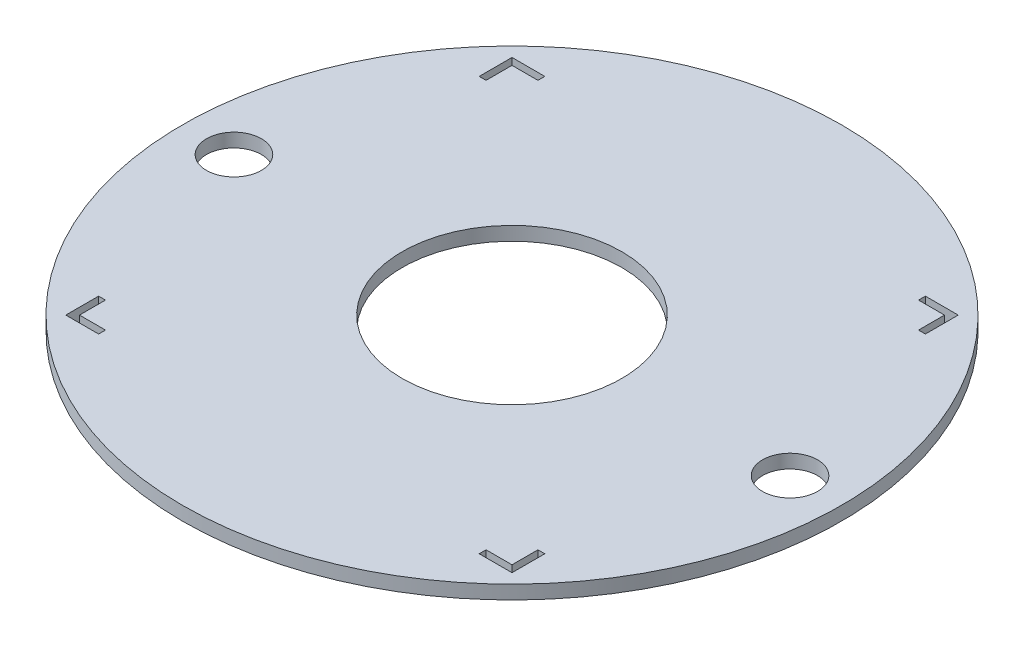
ISO-10303-21;
HEADER;
FILE_DESCRIPTION(('STEP AP214'),'2;1');
FILE_NAME('part.step','',(''),(''),'','','');
FILE_SCHEMA(('AUTOMOTIVE_DESIGN { 1 0 10303 214 1 1 1 1 }'));
ENDSEC;
DATA;
#1=APPLICATION_CONTEXT('core data for automotive mechanical design processes');
#2=APPLICATION_PROTOCOL_DEFINITION('international standard','automotive_design',2000,#1);
#3=PRODUCT_CONTEXT('',#1,'mechanical');
#4=PRODUCT('Part','Part','',(#3));
#5=PRODUCT_RELATED_PRODUCT_CATEGORY('part','',(#4));
#6=PRODUCT_DEFINITION_FORMATION('','',#4);
#7=PRODUCT_DEFINITION_CONTEXT('part definition',#1,'design');
#8=PRODUCT_DEFINITION('design','',#6,#7);
#9=PRODUCT_DEFINITION_SHAPE('','',#8);
#10=(LENGTH_UNIT() NAMED_UNIT(*) SI_UNIT(.MILLI.,.METRE.));
#11=(NAMED_UNIT(*) PLANE_ANGLE_UNIT() SI_UNIT($,.RADIAN.));
#12=(NAMED_UNIT(*) SI_UNIT($,.STERADIAN.) SOLID_ANGLE_UNIT());
#13=UNCERTAINTY_MEASURE_WITH_UNIT(LENGTH_MEASURE(1.E-05),#10,'distance_accuracy_value','');
#14=(GEOMETRIC_REPRESENTATION_CONTEXT(3) GLOBAL_UNCERTAINTY_ASSIGNED_CONTEXT((#13)) GLOBAL_UNIT_ASSIGNED_CONTEXT((#10,
#11,#12)) REPRESENTATION_CONTEXT('',''));
#15=CARTESIAN_POINT('',(0.,0.,0.));
#16=DIRECTION('',(0.,0.,1.));
#17=DIRECTION('',(1.,0.,0.));
#18=AXIS2_PLACEMENT_3D('',#15,#16,#17);
#19=CARTESIAN_POINT('',(0.,3.175,0.));
#20=DIRECTION('',(0.,1.,0.));
#21=DIRECTION('',(0.,0.,1.));
#22=AXIS2_PLACEMENT_3D('',#19,#20,#21);
#23=PLANE('',#22);
#24=CARTESIAN_POINT('',(64.2875,3.175,0.));
#25=DIRECTION('',(0.,1.,0.));
#26=DIRECTION('',(0.,0.,1.));
#27=AXIS2_PLACEMENT_3D('',#24,#25,#26);
#28=CIRCLE('',#27,6.35);
#29=CARTESIAN_POINT('',(64.2875,3.175,6.35));
#30=VERTEX_POINT('',#29);
#31=EDGE_CURVE('E395',#30,#30,#28,.T.);
#32=ORIENTED_EDGE('',*,*,#31,.F.);
#33=EDGE_LOOP('',(#32));
#34=FACE_BOUND('',#33,.T.);
#35=CARTESIAN_POINT('',(-64.2875,3.175,0.));
#36=DIRECTION('',(0.,1.,0.));
#37=DIRECTION('',(0.,0.,1.));
#38=AXIS2_PLACEMENT_3D('',#35,#36,#37);
#39=CIRCLE('',#38,6.35);
#40=CARTESIAN_POINT('',(-64.2875,3.175,6.35));
#41=VERTEX_POINT('',#40);
#42=EDGE_CURVE('E386',#41,#41,#39,.T.);
#43=ORIENTED_EDGE('',*,*,#42,.F.);
#44=EDGE_LOOP('',(#43));
#45=FACE_BOUND('',#44,.T.);
#46=CARTESIAN_POINT('',(0.,3.175,0.));
#47=DIRECTION('',(0.,1.,0.));
#48=DIRECTION('',(0.,0.,1.));
#49=AXIS2_PLACEMENT_3D('',#46,#47,#48);
#50=CIRCLE('',#49,25.4);
#51=CARTESIAN_POINT('',(0.,3.175,25.4));
#52=VERTEX_POINT('',#51);
#53=EDGE_CURVE('E385',#52,#52,#50,.T.);
#54=ORIENTED_EDGE('',*,*,#53,.F.);
#55=EDGE_LOOP('',(#54));
#56=FACE_BOUND('',#55,.T.);
#57=CARTESIAN_POINT('',(0.,3.175,0.));
#58=DIRECTION('',(0.,1.,0.));
#59=DIRECTION('',(0.,0.,1.));
#60=AXIS2_PLACEMENT_3D('',#57,#58,#59);
#61=CIRCLE('',#60,76.2);
#62=CARTESIAN_POINT('',(0.,3.175,76.2));
#63=VERTEX_POINT('',#62);
#64=EDGE_CURVE('E11',#63,#63,#61,.T.);
#65=ORIENTED_EDGE('',*,*,#64,.T.);
#66=EDGE_LOOP('',(#65));
#67=FACE_BOUND('',#66,.T.);
#68=DIRECTION('',(1.,0.,0.));
#69=VECTOR('',#68,1.);
#70=CARTESIAN_POINT('',(51.5875,3.175,-44.0000000000001));
#71=LINE('',#70,#69);
#72=CARTESIAN_POINT('',(50.,3.175,-44.));
#73=VERTEX_POINT('',#72);
#74=CARTESIAN_POINT('',(51.5875,3.175,-44.0000000000001));
#75=VERTEX_POINT('',#74);
#76=EDGE_CURVE('E340',#73,#75,#71,.T.);
#77=ORIENTED_EDGE('',*,*,#76,.F.);
#78=DIRECTION('',(0.,0.,1.));
#79=VECTOR('',#78,1.);
#80=CARTESIAN_POINT('',(50.,3.175,-50.));
#81=LINE('',#80,#79);
#82=CARTESIAN_POINT('',(50.,3.175,-50.));
#83=VERTEX_POINT('',#82);
#84=EDGE_CURVE('E338',#83,#73,#81,.T.);
#85=ORIENTED_EDGE('',*,*,#84,.F.);
#86=DIRECTION('',(1.,0.,0.));
#87=VECTOR('',#86,1.);
#88=CARTESIAN_POINT('',(50.,3.175,-50.));
#89=LINE('',#88,#87);
#90=CARTESIAN_POINT('',(44.,3.175,-50.));
#91=VERTEX_POINT('',#90);
#92=EDGE_CURVE('E350',#91,#83,#89,.T.);
#93=ORIENTED_EDGE('',*,*,#92,.F.);
#94=DIRECTION('',(0.,0.,1.));
#95=VECTOR('',#94,1.);
#96=CARTESIAN_POINT('',(44.,3.175,-51.5875));
#97=LINE('',#96,#95);
#98=CARTESIAN_POINT('',(44.,3.175,-51.5875));
#99=VERTEX_POINT('',#98);
#100=EDGE_CURVE('E347',#99,#91,#97,.T.);
#101=ORIENTED_EDGE('',*,*,#100,.F.);
#102=DIRECTION('',(-1.,0.,0.));
#103=VECTOR('',#102,1.);
#104=CARTESIAN_POINT('',(51.5875,3.175,-51.5875000000001));
#105=LINE('',#104,#103);
#106=CARTESIAN_POINT('',(51.5875,3.175,-51.5875000000001));
#107=VERTEX_POINT('',#106);
#108=EDGE_CURVE('E345',#107,#99,#105,.T.);
#109=ORIENTED_EDGE('',*,*,#108,.F.);
#110=DIRECTION('',(0.,0.,-1.));
#111=VECTOR('',#110,1.);
#112=CARTESIAN_POINT('',(51.5875,3.175,-51.5875000000001));
#113=LINE('',#112,#111);
#114=EDGE_CURVE('E343',#75,#107,#113,.T.);
#115=ORIENTED_EDGE('',*,*,#114,.F.);
#116=EDGE_LOOP('',(#77,#85,#93,#101,#109,#115));
#117=FACE_BOUND('',#116,.T.);
#118=DIRECTION('',(1.,0.,0.));
#119=VECTOR('',#118,1.);
#120=CARTESIAN_POINT('',(-51.5875,3.175,51.5875));
#121=LINE('',#120,#119);
#122=CARTESIAN_POINT('',(-51.5875,3.175,51.5875));
#123=VERTEX_POINT('',#122);
#124=CARTESIAN_POINT('',(-44.,3.175,51.5875));
#125=VERTEX_POINT('',#124);
#126=EDGE_CURVE('E295',#123,#125,#121,.T.);
#127=ORIENTED_EDGE('',*,*,#126,.F.);
#128=DIRECTION('',(0.,0.,1.));
#129=VECTOR('',#128,1.);
#130=CARTESIAN_POINT('',(-51.5875,3.175,51.5875));
#131=LINE('',#130,#129);
#132=CARTESIAN_POINT('',(-51.5875,3.175,44.));
#133=VERTEX_POINT('',#132);
#134=EDGE_CURVE('E293',#133,#123,#131,.T.);
#135=ORIENTED_EDGE('',*,*,#134,.F.);
#136=DIRECTION('',(-1.,0.,0.));
#137=VECTOR('',#136,1.);
#138=CARTESIAN_POINT('',(-51.5875,3.175,44.));
#139=LINE('',#138,#137);
#140=CARTESIAN_POINT('',(-50.,3.175,44.));
#141=VERTEX_POINT('',#140);
#142=EDGE_CURVE('E305',#141,#133,#139,.T.);
#143=ORIENTED_EDGE('',*,*,#142,.F.);
#144=DIRECTION('',(0.,0.,-1.));
#145=VECTOR('',#144,1.);
#146=CARTESIAN_POINT('',(-50.,3.175,50.));
#147=LINE('',#146,#145);
#148=CARTESIAN_POINT('',(-50.,3.175,50.));
#149=VERTEX_POINT('',#148);
#150=EDGE_CURVE('E302',#149,#141,#147,.T.);
#151=ORIENTED_EDGE('',*,*,#150,.F.);
#152=DIRECTION('',(-1.,0.,0.));
#153=VECTOR('',#152,1.);
#154=CARTESIAN_POINT('',(-50.,3.175,50.));
#155=LINE('',#154,#153);
#156=CARTESIAN_POINT('',(-44.,3.175,50.));
#157=VERTEX_POINT('',#156);
#158=EDGE_CURVE('E300',#157,#149,#155,.T.);
#159=ORIENTED_EDGE('',*,*,#158,.F.);
#160=DIRECTION('',(0.,0.,-1.));
#161=VECTOR('',#160,1.);
#162=CARTESIAN_POINT('',(-44.,3.175,51.5875));
#163=LINE('',#162,#161);
#164=EDGE_CURVE('E298',#125,#157,#163,.T.);
#165=ORIENTED_EDGE('',*,*,#164,.F.);
#166=EDGE_LOOP('',(#127,#135,#143,#151,#159,#165));
#167=FACE_BOUND('',#166,.T.);
#168=DIRECTION('',(0.,0.,-1.));
#169=VECTOR('',#168,1.);
#170=CARTESIAN_POINT('',(-44.,3.175,-51.5875));
#171=LINE('',#170,#169);
#172=CARTESIAN_POINT('',(-44.,3.175,-50.));
#173=VERTEX_POINT('',#172);
#174=CARTESIAN_POINT('',(-44.,3.175,-51.5875));
#175=VERTEX_POINT('',#174);
#176=EDGE_CURVE('E250',#173,#175,#171,.T.);
#177=ORIENTED_EDGE('',*,*,#176,.F.);
#178=DIRECTION('',(1.,0.,0.));
#179=VECTOR('',#178,1.);
#180=CARTESIAN_POINT('',(-50.,3.175,-50.));
#181=LINE('',#180,#179);
#182=CARTESIAN_POINT('',(-50.,3.175,-50.));
#183=VERTEX_POINT('',#182);
#184=EDGE_CURVE('E248',#183,#173,#181,.T.);
#185=ORIENTED_EDGE('',*,*,#184,.F.);
#186=DIRECTION('',(0.,0.,-1.));
#187=VECTOR('',#186,1.);
#188=CARTESIAN_POINT('',(-50.,3.175,-50.));
#189=LINE('',#188,#187);
#190=CARTESIAN_POINT('',(-50.,3.175,-44.));
#191=VERTEX_POINT('',#190);
#192=EDGE_CURVE('E260',#191,#183,#189,.T.);
#193=ORIENTED_EDGE('',*,*,#192,.F.);
#194=DIRECTION('',(1.,0.,0.));
#195=VECTOR('',#194,1.);
#196=CARTESIAN_POINT('',(-51.5875,3.175,-44.));
#197=LINE('',#196,#195);
#198=CARTESIAN_POINT('',(-51.5875,3.175,-44.));
#199=VERTEX_POINT('',#198);
#200=EDGE_CURVE('E257',#199,#191,#197,.T.);
#201=ORIENTED_EDGE('',*,*,#200,.F.);
#202=DIRECTION('',(0.,0.,1.));
#203=VECTOR('',#202,1.);
#204=CARTESIAN_POINT('',(-51.5875,3.175,-51.5875));
#205=LINE('',#204,#203);
#206=CARTESIAN_POINT('',(-51.5875,3.175,-51.5875));
#207=VERTEX_POINT('',#206);
#208=EDGE_CURVE('E255',#207,#199,#205,.T.);
#209=ORIENTED_EDGE('',*,*,#208,.F.);
#210=DIRECTION('',(-1.,0.,0.));
#211=VECTOR('',#210,1.);
#212=CARTESIAN_POINT('',(-51.5875,3.175,-51.5875));
#213=LINE('',#212,#211);
#214=EDGE_CURVE('E253',#175,#207,#213,.T.);
#215=ORIENTED_EDGE('',*,*,#214,.F.);
#216=EDGE_LOOP('',(#177,#185,#193,#201,#209,#215));
#217=FACE_BOUND('',#216,.T.);
#218=DIRECTION('',(0.,0.,-1.));
#219=VECTOR('',#218,1.);
#220=CARTESIAN_POINT('',(51.5875,3.175,51.5875));
#221=LINE('',#220,#219);
#222=CARTESIAN_POINT('',(51.5875,3.175,51.5875));
#223=VERTEX_POINT('',#222);
#224=CARTESIAN_POINT('',(51.5875,3.175,44.));
#225=VERTEX_POINT('',#224);
#226=EDGE_CURVE('E203',#223,#225,#221,.T.);
#227=ORIENTED_EDGE('',*,*,#226,.F.);
#228=DIRECTION('',(1.,0.,0.));
#229=VECTOR('',#228,1.);
#230=CARTESIAN_POINT('',(51.5875,3.175,51.5875));
#231=LINE('',#230,#229);
#232=CARTESIAN_POINT('',(44.,3.175,51.5875));
#233=VERTEX_POINT('',#232);
#234=EDGE_CURVE('E195',#233,#223,#231,.T.);
#235=ORIENTED_EDGE('',*,*,#234,.F.);
#236=DIRECTION('',(0.,0.,1.));
#237=VECTOR('',#236,1.);
#238=CARTESIAN_POINT('',(44.,3.175,51.5875));
#239=LINE('',#238,#237);
#240=CARTESIAN_POINT('',(44.,3.175,50.));
#241=VERTEX_POINT('',#240);
#242=EDGE_CURVE('E225',#241,#233,#239,.T.);
#243=ORIENTED_EDGE('',*,*,#242,.F.);
#244=DIRECTION('',(-1.,0.,0.));
#245=VECTOR('',#244,1.);
#246=CARTESIAN_POINT('',(50.,3.175,50.));
#247=LINE('',#246,#245);
#248=CARTESIAN_POINT('',(50.,3.175,50.));
#249=VERTEX_POINT('',#248);
#250=EDGE_CURVE('E223',#249,#241,#247,.T.);
#251=ORIENTED_EDGE('',*,*,#250,.F.);
#252=DIRECTION('',(0.,0.,1.));
#253=VECTOR('',#252,1.);
#254=CARTESIAN_POINT('',(50.,3.175,50.));
#255=LINE('',#254,#253);
#256=CARTESIAN_POINT('',(50.,3.175,44.));
#257=VERTEX_POINT('',#256);
#258=EDGE_CURVE('E218',#257,#249,#255,.T.);
#259=ORIENTED_EDGE('',*,*,#258,.F.);
#260=DIRECTION('',(-1.,0.,0.));
#261=VECTOR('',#260,1.);
#262=CARTESIAN_POINT('',(51.5875,3.175,44.));
#263=LINE('',#262,#261);
#264=EDGE_CURVE('E216',#225,#257,#263,.T.);
#265=ORIENTED_EDGE('',*,*,#264,.F.);
#266=EDGE_LOOP('',(#227,#235,#243,#251,#259,#265));
#267=FACE_BOUND('',#266,.T.);
#268=ADVANCED_FACE('F32',(#34,#45,#56,#67,#117,#167,#217,#267),#23,.T.);
#269=CARTESIAN_POINT('',(0.,0.,0.));
#270=DIRECTION('',(0.,1.,0.));
#271=DIRECTION('',(0.,0.,1.));
#272=AXIS2_PLACEMENT_3D('',#269,#270,#271);
#273=PLANE('',#272);
#274=CARTESIAN_POINT('',(64.2875,0.,0.));
#275=DIRECTION('',(0.,1.,0.));
#276=DIRECTION('',(0.,0.,1.));
#277=AXIS2_PLACEMENT_3D('',#274,#275,#276);
#278=CIRCLE('',#277,6.35);
#279=CARTESIAN_POINT('',(64.2875,0.,6.35));
#280=VERTEX_POINT('',#279);
#281=EDGE_CURVE('E36',#280,#280,#278,.T.);
#282=ORIENTED_EDGE('',*,*,#281,.T.);
#283=EDGE_LOOP('',(#282));
#284=FACE_BOUND('',#283,.T.);
#285=CARTESIAN_POINT('',(-64.2875,0.,0.));
#286=DIRECTION('',(0.,1.,0.));
#287=DIRECTION('',(0.,0.,1.));
#288=AXIS2_PLACEMENT_3D('',#285,#286,#287);
#289=CIRCLE('',#288,6.35);
#290=CARTESIAN_POINT('',(-64.2875,0.,6.35));
#291=VERTEX_POINT('',#290);
#292=EDGE_CURVE('E383',#291,#291,#289,.T.);
#293=ORIENTED_EDGE('',*,*,#292,.T.);
#294=EDGE_LOOP('',(#293));
#295=FACE_BOUND('',#294,.T.);
#296=CARTESIAN_POINT('',(0.,0.,0.));
#297=DIRECTION('',(0.,1.,0.));
#298=DIRECTION('',(0.,0.,1.));
#299=AXIS2_PLACEMENT_3D('',#296,#297,#298);
#300=CIRCLE('',#299,25.4);
#301=CARTESIAN_POINT('',(0.,0.,25.4));
#302=VERTEX_POINT('',#301);
#303=EDGE_CURVE('E228',#302,#302,#300,.T.);
#304=ORIENTED_EDGE('',*,*,#303,.T.);
#305=EDGE_LOOP('',(#304));
#306=FACE_BOUND('',#305,.T.);
#307=DIRECTION('',(1.,0.,0.));
#308=VECTOR('',#307,1.);
#309=CARTESIAN_POINT('',(-50.,0.,-50.));
#310=LINE('',#309,#308);
#311=CARTESIAN_POINT('',(-50.,0.,-50.));
#312=VERTEX_POINT('',#311);
#313=CARTESIAN_POINT('',(-44.,0.,-50.));
#314=VERTEX_POINT('',#313);
#315=EDGE_CURVE('E211',#312,#314,#310,.T.);
#316=ORIENTED_EDGE('',*,*,#315,.T.);
#317=DIRECTION('',(0.,0.,-1.));
#318=VECTOR('',#317,1.);
#319=CARTESIAN_POINT('',(-44.,0.,-51.5875));
#320=LINE('',#319,#318);
#321=CARTESIAN_POINT('',(-44.,0.,-51.5875));
#322=VERTEX_POINT('',#321);
#323=EDGE_CURVE('E265',#314,#322,#320,.T.);
#324=ORIENTED_EDGE('',*,*,#323,.T.);
#325=DIRECTION('',(-1.,0.,0.));
#326=VECTOR('',#325,1.);
#327=CARTESIAN_POINT('',(-51.5875,0.,-51.5875));
#328=LINE('',#327,#326);
#329=CARTESIAN_POINT('',(-51.5875,0.,-51.5875));
#330=VERTEX_POINT('',#329);
#331=EDGE_CURVE('E268',#322,#330,#328,.T.);
#332=ORIENTED_EDGE('',*,*,#331,.T.);
#333=DIRECTION('',(0.,0.,1.));
#334=VECTOR('',#333,1.);
#335=CARTESIAN_POINT('',(-51.5875,0.,-51.5875));
#336=LINE('',#335,#334);
#337=CARTESIAN_POINT('',(-51.5875,0.,-44.));
#338=VERTEX_POINT('',#337);
#339=EDGE_CURVE('E271',#330,#338,#336,.T.);
#340=ORIENTED_EDGE('',*,*,#339,.T.);
#341=DIRECTION('',(1.,0.,0.));
#342=VECTOR('',#341,1.);
#343=CARTESIAN_POINT('',(-51.5875,0.,-44.));
#344=LINE('',#343,#342);
#345=CARTESIAN_POINT('',(-50.,0.,-44.));
#346=VERTEX_POINT('',#345);
#347=EDGE_CURVE('E274',#338,#346,#344,.T.);
#348=ORIENTED_EDGE('',*,*,#347,.T.);
#349=DIRECTION('',(0.,0.,-1.));
#350=VECTOR('',#349,1.);
#351=CARTESIAN_POINT('',(-50.,0.,-50.));
#352=LINE('',#351,#350);
#353=EDGE_CURVE('E251',#346,#312,#352,.T.);
#354=ORIENTED_EDGE('',*,*,#353,.T.);
#355=EDGE_LOOP('',(#316,#324,#332,#340,#348,#354));
#356=FACE_BOUND('',#355,.T.);
#357=DIRECTION('',(0.,0.,1.));
#358=VECTOR('',#357,1.);
#359=CARTESIAN_POINT('',(50.,0.,-50.));
#360=LINE('',#359,#358);
#361=CARTESIAN_POINT('',(50.,0.,-50.));
#362=VERTEX_POINT('',#361);
#363=CARTESIAN_POINT('',(50.,0.,-44.));
#364=VERTEX_POINT('',#363);
#365=EDGE_CURVE('E337',#362,#364,#360,.T.);
#366=ORIENTED_EDGE('',*,*,#365,.T.);
#367=DIRECTION('',(1.,0.,0.));
#368=VECTOR('',#367,1.);
#369=CARTESIAN_POINT('',(51.5875,0.,-44.0000000000001));
#370=LINE('',#369,#368);
#371=CARTESIAN_POINT('',(51.5875,0.,-44.0000000000001));
#372=VERTEX_POINT('',#371);
#373=EDGE_CURVE('E355',#364,#372,#370,.T.);
#374=ORIENTED_EDGE('',*,*,#373,.T.);
#375=DIRECTION('',(0.,0.,-1.));
#376=VECTOR('',#375,1.);
#377=CARTESIAN_POINT('',(51.5875,0.,-51.5875000000001));
#378=LINE('',#377,#376);
#379=CARTESIAN_POINT('',(51.5875,0.,-51.5875000000001));
#380=VERTEX_POINT('',#379);
#381=EDGE_CURVE('E358',#372,#380,#378,.T.);
#382=ORIENTED_EDGE('',*,*,#381,.T.);
#383=DIRECTION('',(-1.,0.,0.));
#384=VECTOR('',#383,1.);
#385=CARTESIAN_POINT('',(51.5875,0.,-51.5875000000001));
#386=LINE('',#385,#384);
#387=CARTESIAN_POINT('',(44.,0.,-51.5875));
#388=VERTEX_POINT('',#387);
#389=EDGE_CURVE('E361',#380,#388,#386,.T.);
#390=ORIENTED_EDGE('',*,*,#389,.T.);
#391=DIRECTION('',(0.,0.,1.));
#392=VECTOR('',#391,1.);
#393=CARTESIAN_POINT('',(44.,0.,-51.5875));
#394=LINE('',#393,#392);
#395=CARTESIAN_POINT('',(44.,0.,-50.));
#396=VERTEX_POINT('',#395);
#397=EDGE_CURVE('E364',#388,#396,#394,.T.);
#398=ORIENTED_EDGE('',*,*,#397,.T.);
#399=DIRECTION('',(1.,0.,0.));
#400=VECTOR('',#399,1.);
#401=CARTESIAN_POINT('',(50.,0.,-50.));
#402=LINE('',#401,#400);
#403=EDGE_CURVE('E341',#396,#362,#402,.T.);
#404=ORIENTED_EDGE('',*,*,#403,.T.);
#405=EDGE_LOOP('',(#366,#374,#382,#390,#398,#404));
#406=FACE_BOUND('',#405,.T.);
#407=CARTESIAN_POINT('',(0.,0.,0.));
#408=DIRECTION('',(0.,1.,0.));
#409=DIRECTION('',(0.,0.,1.));
#410=AXIS2_PLACEMENT_3D('',#407,#408,#409);
#411=CIRCLE('',#410,76.2);
#412=CARTESIAN_POINT('',(0.,0.,76.2));
#413=VERTEX_POINT('',#412);
#414=EDGE_CURVE('E41',#413,#413,#411,.T.);
#415=ORIENTED_EDGE('',*,*,#414,.F.);
#416=EDGE_LOOP('',(#415));
#417=FACE_BOUND('',#416,.T.);
#418=DIRECTION('',(0.,0.,1.));
#419=VECTOR('',#418,1.);
#420=CARTESIAN_POINT('',(-51.5875,0.,51.5875));
#421=LINE('',#420,#419);
#422=CARTESIAN_POINT('',(-51.5875,0.,44.));
#423=VERTEX_POINT('',#422);
#424=CARTESIAN_POINT('',(-51.5875,0.,51.5875));
#425=VERTEX_POINT('',#424);
#426=EDGE_CURVE('E292',#423,#425,#421,.T.);
#427=ORIENTED_EDGE('',*,*,#426,.T.);
#428=DIRECTION('',(1.,0.,0.));
#429=VECTOR('',#428,1.);
#430=CARTESIAN_POINT('',(-51.5875,0.,51.5875));
#431=LINE('',#430,#429);
#432=CARTESIAN_POINT('',(-44.,0.,51.5875));
#433=VERTEX_POINT('',#432);
#434=EDGE_CURVE('E310',#425,#433,#431,.T.);
#435=ORIENTED_EDGE('',*,*,#434,.T.);
#436=DIRECTION('',(0.,0.,-1.));
#437=VECTOR('',#436,1.);
#438=CARTESIAN_POINT('',(-44.,0.,51.5875));
#439=LINE('',#438,#437);
#440=CARTESIAN_POINT('',(-44.,0.,50.));
#441=VERTEX_POINT('',#440);
#442=EDGE_CURVE('E313',#433,#441,#439,.T.);
#443=ORIENTED_EDGE('',*,*,#442,.T.);
#444=DIRECTION('',(-1.,0.,0.));
#445=VECTOR('',#444,1.);
#446=CARTESIAN_POINT('',(-50.,0.,50.));
#447=LINE('',#446,#445);
#448=CARTESIAN_POINT('',(-50.,0.,50.));
#449=VERTEX_POINT('',#448);
#450=EDGE_CURVE('E316',#441,#449,#447,.T.);
#451=ORIENTED_EDGE('',*,*,#450,.T.);
#452=DIRECTION('',(0.,0.,-1.));
#453=VECTOR('',#452,1.);
#454=CARTESIAN_POINT('',(-50.,0.,50.));
#455=LINE('',#454,#453);
#456=CARTESIAN_POINT('',(-50.,0.,44.));
#457=VERTEX_POINT('',#456);
#458=EDGE_CURVE('E319',#449,#457,#455,.T.);
#459=ORIENTED_EDGE('',*,*,#458,.T.);
#460=DIRECTION('',(-1.,0.,0.));
#461=VECTOR('',#460,1.);
#462=CARTESIAN_POINT('',(-51.5875,0.,44.));
#463=LINE('',#462,#461);
#464=EDGE_CURVE('E296',#457,#423,#463,.T.);
#465=ORIENTED_EDGE('',*,*,#464,.T.);
#466=EDGE_LOOP('',(#427,#435,#443,#451,#459,#465));
#467=FACE_BOUND('',#466,.T.);
#468=DIRECTION('',(1.,0.,0.));
#469=VECTOR('',#468,1.);
#470=CARTESIAN_POINT('',(51.5875,0.,51.5875));
#471=LINE('',#470,#469);
#472=CARTESIAN_POINT('',(44.,0.,51.5875));
#473=VERTEX_POINT('',#472);
#474=CARTESIAN_POINT('',(51.5875,0.,51.5875));
#475=VERTEX_POINT('',#474);
#476=EDGE_CURVE('E57',#473,#475,#471,.T.);
#477=ORIENTED_EDGE('',*,*,#476,.T.);
#478=DIRECTION('',(0.,0.,-1.));
#479=VECTOR('',#478,1.);
#480=CARTESIAN_POINT('',(51.5875,0.,51.5875));
#481=LINE('',#480,#479);
#482=CARTESIAN_POINT('',(51.5875,0.,44.));
#483=VERTEX_POINT('',#482);
#484=EDGE_CURVE('E210',#475,#483,#481,.T.);
#485=ORIENTED_EDGE('',*,*,#484,.T.);
#486=DIRECTION('',(-1.,0.,0.));
#487=VECTOR('',#486,1.);
#488=CARTESIAN_POINT('',(51.5875,0.,44.));
#489=LINE('',#488,#487);
#490=CARTESIAN_POINT('',(50.,0.,44.));
#491=VERTEX_POINT('',#490);
#492=EDGE_CURVE('E230',#483,#491,#489,.T.);
#493=ORIENTED_EDGE('',*,*,#492,.T.);
#494=DIRECTION('',(0.,0.,1.));
#495=VECTOR('',#494,1.);
#496=CARTESIAN_POINT('',(50.,0.,50.));
#497=LINE('',#496,#495);
#498=CARTESIAN_POINT('',(50.,0.,50.));
#499=VERTEX_POINT('',#498);
#500=EDGE_CURVE('E233',#491,#499,#497,.T.);
#501=ORIENTED_EDGE('',*,*,#500,.T.);
#502=DIRECTION('',(-1.,0.,0.));
#503=VECTOR('',#502,1.);
#504=CARTESIAN_POINT('',(50.,0.,50.));
#505=LINE('',#504,#503);
#506=CARTESIAN_POINT('',(44.,0.,50.));
#507=VERTEX_POINT('',#506);
#508=EDGE_CURVE('E236',#499,#507,#505,.T.);
#509=ORIENTED_EDGE('',*,*,#508,.T.);
#510=DIRECTION('',(0.,0.,1.));
#511=VECTOR('',#510,1.);
#512=CARTESIAN_POINT('',(44.,0.,51.5875));
#513=LINE('',#512,#511);
#514=EDGE_CURVE('E204',#507,#473,#513,.T.);
#515=ORIENTED_EDGE('',*,*,#514,.T.);
#516=EDGE_LOOP('',(#477,#485,#493,#501,#509,#515));
#517=FACE_BOUND('',#516,.T.);
#518=ADVANCED_FACE('F401',(#284,#295,#306,#356,#406,#417,#467,#517),#273,.F.);
#519=CARTESIAN_POINT('',(0.,3.175,0.));
#520=DIRECTION('',(0.,-1.,0.));
#521=DIRECTION('',(0.,0.,-1.));
#522=AXIS2_PLACEMENT_3D('',#519,#520,#521);
#523=CYLINDRICAL_SURFACE('',#522,76.2);
#524=ORIENTED_EDGE('',*,*,#64,.F.);
#525=EDGE_LOOP('',(#524));
#526=FACE_BOUND('',#525,.T.);
#527=ORIENTED_EDGE('',*,*,#414,.T.);
#528=EDGE_LOOP('',(#527));
#529=FACE_BOUND('',#528,.T.);
#530=ADVANCED_FACE('F34',(#526,#529),#523,.T.);
#531=CARTESIAN_POINT('',(50.,3.175,-50.));
#532=DIRECTION('',(1.,0.,0.));
#533=DIRECTION('',(0.,0.,-1.));
#534=AXIS2_PLACEMENT_3D('',#531,#532,#533);
#535=PLANE('',#534);
#536=ORIENTED_EDGE('',*,*,#365,.F.);
#537=DIRECTION('',(0.,-1.,0.));
#538=VECTOR('',#537,1.);
#539=CARTESIAN_POINT('',(50.,3.175,-50.));
#540=LINE('',#539,#538);
#541=EDGE_CURVE('E352',#83,#362,#540,.T.);
#542=ORIENTED_EDGE('',*,*,#541,.F.);
#543=ORIENTED_EDGE('',*,*,#84,.T.);
#544=DIRECTION('',(0.,-1.,0.));
#545=VECTOR('',#544,1.);
#546=CARTESIAN_POINT('',(50.,3.175,-44.));
#547=LINE('',#546,#545);
#548=EDGE_CURVE('E379',#73,#364,#547,.T.);
#549=ORIENTED_EDGE('',*,*,#548,.T.);
#550=EDGE_LOOP('',(#536,#542,#543,#549));
#551=FACE_BOUND('',#550,.T.);
#552=ADVANCED_FACE('F511',(#551),#535,.T.);
#553=CARTESIAN_POINT('',(51.5875,3.175,-44.0000000000001));
#554=DIRECTION('',(0.,0.,-1.));
#555=DIRECTION('',(-1.,0.,0.));
#556=AXIS2_PLACEMENT_3D('',#553,#554,#555);
#557=PLANE('',#556);
#558=ORIENTED_EDGE('',*,*,#373,.F.);
#559=ORIENTED_EDGE('',*,*,#548,.F.);
#560=ORIENTED_EDGE('',*,*,#76,.T.);
#561=DIRECTION('',(0.,-1.,0.));
#562=VECTOR('',#561,1.);
#563=CARTESIAN_POINT('',(51.5875,3.175,-44.0000000000001));
#564=LINE('',#563,#562);
#565=EDGE_CURVE('E377',#75,#372,#564,.T.);
#566=ORIENTED_EDGE('',*,*,#565,.T.);
#567=EDGE_LOOP('',(#558,#559,#560,#566));
#568=FACE_BOUND('',#567,.T.);
#569=ADVANCED_FACE('F507',(#568),#557,.T.);
#570=CARTESIAN_POINT('',(51.5875,3.175,-51.5875000000001));
#571=DIRECTION('',(-1.,0.,0.));
#572=DIRECTION('',(0.,0.,1.));
#573=AXIS2_PLACEMENT_3D('',#570,#571,#572);
#574=PLANE('',#573);
#575=ORIENTED_EDGE('',*,*,#381,.F.);
#576=ORIENTED_EDGE('',*,*,#565,.F.);
#577=ORIENTED_EDGE('',*,*,#114,.T.);
#578=DIRECTION('',(0.,-1.,0.));
#579=VECTOR('',#578,1.);
#580=CARTESIAN_POINT('',(51.5875,3.175,-51.5875000000001));
#581=LINE('',#580,#579);
#582=EDGE_CURVE('E375',#107,#380,#581,.T.);
#583=ORIENTED_EDGE('',*,*,#582,.T.);
#584=EDGE_LOOP('',(#575,#576,#577,#583));
#585=FACE_BOUND('',#584,.T.);
#586=ADVANCED_FACE('F503',(#585),#574,.T.);
#587=CARTESIAN_POINT('',(51.5875,3.175,-51.5875000000001));
#588=DIRECTION('',(0.,0.,1.));
#589=DIRECTION('',(1.,0.,0.));
#590=AXIS2_PLACEMENT_3D('',#587,#588,#589);
#591=PLANE('',#590);
#592=ORIENTED_EDGE('',*,*,#389,.F.);
#593=ORIENTED_EDGE('',*,*,#582,.F.);
#594=ORIENTED_EDGE('',*,*,#108,.T.);
#595=DIRECTION('',(0.,-1.,0.));
#596=VECTOR('',#595,1.);
#597=CARTESIAN_POINT('',(44.,3.175,-51.5875));
#598=LINE('',#597,#596);
#599=EDGE_CURVE('E373',#99,#388,#598,.T.);
#600=ORIENTED_EDGE('',*,*,#599,.T.);
#601=EDGE_LOOP('',(#592,#593,#594,#600));
#602=FACE_BOUND('',#601,.T.);
#603=ADVANCED_FACE('F499',(#602),#591,.T.);
#604=CARTESIAN_POINT('',(44.,3.175,-51.5875));
#605=DIRECTION('',(1.,0.,0.));
#606=DIRECTION('',(0.,0.,-1.));
#607=AXIS2_PLACEMENT_3D('',#604,#605,#606);
#608=PLANE('',#607);
#609=ORIENTED_EDGE('',*,*,#397,.F.);
#610=ORIENTED_EDGE('',*,*,#599,.F.);
#611=ORIENTED_EDGE('',*,*,#100,.T.);
#612=DIRECTION('',(0.,-1.,0.));
#613=VECTOR('',#612,1.);
#614=CARTESIAN_POINT('',(44.,3.175,-50.));
#615=LINE('',#614,#613);
#616=EDGE_CURVE('E371',#91,#396,#615,.T.);
#617=ORIENTED_EDGE('',*,*,#616,.T.);
#618=EDGE_LOOP('',(#609,#610,#611,#617));
#619=FACE_BOUND('',#618,.T.);
#620=ADVANCED_FACE('F495',(#619),#608,.T.);
#621=CARTESIAN_POINT('',(50.,3.175,-50.));
#622=DIRECTION('',(0.,0.,-1.));
#623=DIRECTION('',(-1.,0.,0.));
#624=AXIS2_PLACEMENT_3D('',#621,#622,#623);
#625=PLANE('',#624);
#626=ORIENTED_EDGE('',*,*,#403,.F.);
#627=ORIENTED_EDGE('',*,*,#616,.F.);
#628=ORIENTED_EDGE('',*,*,#92,.T.);
#629=ORIENTED_EDGE('',*,*,#541,.T.);
#630=EDGE_LOOP('',(#626,#627,#628,#629));
#631=FACE_BOUND('',#630,.T.);
#632=ADVANCED_FACE('F491',(#631),#625,.T.);
#633=CARTESIAN_POINT('',(-51.5875,3.175,51.5875));
#634=DIRECTION('',(1.,0.,0.));
#635=DIRECTION('',(0.,0.,-1.));
#636=AXIS2_PLACEMENT_3D('',#633,#634,#635);
#637=PLANE('',#636);
#638=ORIENTED_EDGE('',*,*,#426,.F.);
#639=DIRECTION('',(0.,-1.,0.));
#640=VECTOR('',#639,1.);
#641=CARTESIAN_POINT('',(-51.5875,3.175,44.));
#642=LINE('',#641,#640);
#643=EDGE_CURVE('E307',#133,#423,#642,.T.);
#644=ORIENTED_EDGE('',*,*,#643,.F.);
#645=ORIENTED_EDGE('',*,*,#134,.T.);
#646=DIRECTION('',(0.,-1.,0.));
#647=VECTOR('',#646,1.);
#648=CARTESIAN_POINT('',(-51.5875,3.175,51.5875));
#649=LINE('',#648,#647);
#650=EDGE_CURVE('E334',#123,#425,#649,.T.);
#651=ORIENTED_EDGE('',*,*,#650,.T.);
#652=EDGE_LOOP('',(#638,#644,#645,#651));
#653=FACE_BOUND('',#652,.T.);
#654=ADVANCED_FACE('F487',(#653),#637,.T.);
#655=CARTESIAN_POINT('',(-51.5875,3.175,51.5875));
#656=DIRECTION('',(0.,0.,-1.));
#657=DIRECTION('',(-1.,0.,0.));
#658=AXIS2_PLACEMENT_3D('',#655,#656,#657);
#659=PLANE('',#658);
#660=ORIENTED_EDGE('',*,*,#434,.F.);
#661=ORIENTED_EDGE('',*,*,#650,.F.);
#662=ORIENTED_EDGE('',*,*,#126,.T.);
#663=DIRECTION('',(0.,-1.,0.));
#664=VECTOR('',#663,1.);
#665=CARTESIAN_POINT('',(-44.,3.175,51.5875));
#666=LINE('',#665,#664);
#667=EDGE_CURVE('E332',#125,#433,#666,.T.);
#668=ORIENTED_EDGE('',*,*,#667,.T.);
#669=EDGE_LOOP('',(#660,#661,#662,#668));
#670=FACE_BOUND('',#669,.T.);
#671=ADVANCED_FACE('F483',(#670),#659,.T.);
#672=CARTESIAN_POINT('',(-44.,3.175,51.5875));
#673=DIRECTION('',(-1.,0.,0.));
#674=DIRECTION('',(0.,0.,1.));
#675=AXIS2_PLACEMENT_3D('',#672,#673,#674);
#676=PLANE('',#675);
#677=ORIENTED_EDGE('',*,*,#442,.F.);
#678=ORIENTED_EDGE('',*,*,#667,.F.);
#679=ORIENTED_EDGE('',*,*,#164,.T.);
#680=DIRECTION('',(0.,-1.,0.));
#681=VECTOR('',#680,1.);
#682=CARTESIAN_POINT('',(-44.,3.175,50.));
#683=LINE('',#682,#681);
#684=EDGE_CURVE('E330',#157,#441,#683,.T.);
#685=ORIENTED_EDGE('',*,*,#684,.T.);
#686=EDGE_LOOP('',(#677,#678,#679,#685));
#687=FACE_BOUND('',#686,.T.);
#688=ADVANCED_FACE('F479',(#687),#676,.T.);
#689=CARTESIAN_POINT('',(-50.,3.175,50.));
#690=DIRECTION('',(0.,0.,1.));
#691=DIRECTION('',(1.,0.,0.));
#692=AXIS2_PLACEMENT_3D('',#689,#690,#691);
#693=PLANE('',#692);
#694=ORIENTED_EDGE('',*,*,#450,.F.);
#695=ORIENTED_EDGE('',*,*,#684,.F.);
#696=ORIENTED_EDGE('',*,*,#158,.T.);
#697=DIRECTION('',(0.,-1.,0.));
#698=VECTOR('',#697,1.);
#699=CARTESIAN_POINT('',(-50.,3.175,50.));
#700=LINE('',#699,#698);
#701=EDGE_CURVE('E328',#149,#449,#700,.T.);
#702=ORIENTED_EDGE('',*,*,#701,.T.);
#703=EDGE_LOOP('',(#694,#695,#696,#702));
#704=FACE_BOUND('',#703,.T.);
#705=ADVANCED_FACE('F475',(#704),#693,.T.);
#706=CARTESIAN_POINT('',(-50.,3.175,50.));
#707=DIRECTION('',(-1.,0.,0.));
#708=DIRECTION('',(0.,0.,1.));
#709=AXIS2_PLACEMENT_3D('',#706,#707,#708);
#710=PLANE('',#709);
#711=ORIENTED_EDGE('',*,*,#458,.F.);
#712=ORIENTED_EDGE('',*,*,#701,.F.);
#713=ORIENTED_EDGE('',*,*,#150,.T.);
#714=DIRECTION('',(0.,-1.,0.));
#715=VECTOR('',#714,1.);
#716=CARTESIAN_POINT('',(-50.,3.175,44.));
#717=LINE('',#716,#715);
#718=EDGE_CURVE('E326',#141,#457,#717,.T.);
#719=ORIENTED_EDGE('',*,*,#718,.T.);
#720=EDGE_LOOP('',(#711,#712,#713,#719));
#721=FACE_BOUND('',#720,.T.);
#722=ADVANCED_FACE('F471',(#721),#710,.T.);
#723=CARTESIAN_POINT('',(-51.5875,3.175,44.));
#724=DIRECTION('',(0.,0.,1.));
#725=DIRECTION('',(1.,0.,0.));
#726=AXIS2_PLACEMENT_3D('',#723,#724,#725);
#727=PLANE('',#726);
#728=ORIENTED_EDGE('',*,*,#464,.F.);
#729=ORIENTED_EDGE('',*,*,#718,.F.);
#730=ORIENTED_EDGE('',*,*,#142,.T.);
#731=ORIENTED_EDGE('',*,*,#643,.T.);
#732=EDGE_LOOP('',(#728,#729,#730,#731));
#733=FACE_BOUND('',#732,.T.);
#734=ADVANCED_FACE('F468',(#733),#727,.T.);
#735=CARTESIAN_POINT('',(-50.,3.175,-50.));
#736=DIRECTION('',(0.,0.,-1.));
#737=DIRECTION('',(-1.,0.,0.));
#738=AXIS2_PLACEMENT_3D('',#735,#736,#737);
#739=PLANE('',#738);
#740=ORIENTED_EDGE('',*,*,#315,.F.);
#741=DIRECTION('',(0.,-1.,0.));
#742=VECTOR('',#741,1.);
#743=CARTESIAN_POINT('',(-50.,3.175,-50.));
#744=LINE('',#743,#742);
#745=EDGE_CURVE('E262',#183,#312,#744,.T.);
#746=ORIENTED_EDGE('',*,*,#745,.F.);
#747=ORIENTED_EDGE('',*,*,#184,.T.);
#748=DIRECTION('',(0.,-1.,0.));
#749=VECTOR('',#748,1.);
#750=CARTESIAN_POINT('',(-44.,3.175,-50.));
#751=LINE('',#750,#749);
#752=EDGE_CURVE('E289',#173,#314,#751,.T.);
#753=ORIENTED_EDGE('',*,*,#752,.T.);
#754=EDGE_LOOP('',(#740,#746,#747,#753));
#755=FACE_BOUND('',#754,.T.);
#756=ADVANCED_FACE('F442',(#755),#739,.T.);
#757=CARTESIAN_POINT('',(-44.,3.175,-51.5875));
#758=DIRECTION('',(-1.,0.,0.));
#759=DIRECTION('',(0.,0.,1.));
#760=AXIS2_PLACEMENT_3D('',#757,#758,#759);
#761=PLANE('',#760);
#762=ORIENTED_EDGE('',*,*,#323,.F.);
#763=ORIENTED_EDGE('',*,*,#752,.F.);
#764=ORIENTED_EDGE('',*,*,#176,.T.);
#765=DIRECTION('',(0.,-1.,0.));
#766=VECTOR('',#765,1.);
#767=CARTESIAN_POINT('',(-44.,3.175,-51.5875));
#768=LINE('',#767,#766);
#769=EDGE_CURVE('E287',#175,#322,#768,.T.);
#770=ORIENTED_EDGE('',*,*,#769,.T.);
#771=EDGE_LOOP('',(#762,#763,#764,#770));
#772=FACE_BOUND('',#771,.T.);
#773=ADVANCED_FACE('F434',(#772),#761,.T.);
#774=CARTESIAN_POINT('',(-51.5875,3.175,-51.5875));
#775=DIRECTION('',(0.,0.,1.));
#776=DIRECTION('',(1.,0.,0.));
#777=AXIS2_PLACEMENT_3D('',#774,#775,#776);
#778=PLANE('',#777);
#779=ORIENTED_EDGE('',*,*,#331,.F.);
#780=ORIENTED_EDGE('',*,*,#769,.F.);
#781=ORIENTED_EDGE('',*,*,#214,.T.);
#782=DIRECTION('',(0.,-1.,0.));
#783=VECTOR('',#782,1.);
#784=CARTESIAN_POINT('',(-51.5875,3.175,-51.5875));
#785=LINE('',#784,#783);
#786=EDGE_CURVE('E285',#207,#330,#785,.T.);
#787=ORIENTED_EDGE('',*,*,#786,.T.);
#788=EDGE_LOOP('',(#779,#780,#781,#787));
#789=FACE_BOUND('',#788,.T.);
#790=ADVANCED_FACE('F437',(#789),#778,.T.);
#791=CARTESIAN_POINT('',(-51.5875,3.175,-51.5875));
#792=DIRECTION('',(1.,0.,0.));
#793=DIRECTION('',(0.,0.,-1.));
#794=AXIS2_PLACEMENT_3D('',#791,#792,#793);
#795=PLANE('',#794);
#796=ORIENTED_EDGE('',*,*,#339,.F.);
#797=ORIENTED_EDGE('',*,*,#786,.F.);
#798=ORIENTED_EDGE('',*,*,#208,.T.);
#799=DIRECTION('',(0.,-1.,0.));
#800=VECTOR('',#799,1.);
#801=CARTESIAN_POINT('',(-51.5875,3.175,-44.));
#802=LINE('',#801,#800);
#803=EDGE_CURVE('E283',#199,#338,#802,.T.);
#804=ORIENTED_EDGE('',*,*,#803,.T.);
#805=EDGE_LOOP('',(#796,#797,#798,#804));
#806=FACE_BOUND('',#805,.T.);
#807=ADVANCED_FACE('F453',(#806),#795,.T.);
#808=CARTESIAN_POINT('',(-51.5875,3.175,-44.));
#809=DIRECTION('',(0.,0.,-1.));
#810=DIRECTION('',(-1.,0.,0.));
#811=AXIS2_PLACEMENT_3D('',#808,#809,#810);
#812=PLANE('',#811);
#813=ORIENTED_EDGE('',*,*,#347,.F.);
#814=ORIENTED_EDGE('',*,*,#803,.F.);
#815=ORIENTED_EDGE('',*,*,#200,.T.);
#816=DIRECTION('',(0.,-1.,0.));
#817=VECTOR('',#816,1.);
#818=CARTESIAN_POINT('',(-50.,3.175,-44.));
#819=LINE('',#818,#817);
#820=EDGE_CURVE('E281',#191,#346,#819,.T.);
#821=ORIENTED_EDGE('',*,*,#820,.T.);
#822=EDGE_LOOP('',(#813,#814,#815,#821));
#823=FACE_BOUND('',#822,.T.);
#824=ADVANCED_FACE('F450',(#823),#812,.T.);
#825=CARTESIAN_POINT('',(-50.,3.175,-50.));
#826=DIRECTION('',(-1.,0.,0.));
#827=DIRECTION('',(0.,0.,1.));
#828=AXIS2_PLACEMENT_3D('',#825,#826,#827);
#829=PLANE('',#828);
#830=ORIENTED_EDGE('',*,*,#353,.F.);
#831=ORIENTED_EDGE('',*,*,#820,.F.);
#832=ORIENTED_EDGE('',*,*,#192,.T.);
#833=ORIENTED_EDGE('',*,*,#745,.T.);
#834=EDGE_LOOP('',(#830,#831,#832,#833));
#835=FACE_BOUND('',#834,.T.);
#836=ADVANCED_FACE('F446',(#835),#829,.T.);
#837=CARTESIAN_POINT('',(51.5875,3.175,51.5875));
#838=DIRECTION('',(0.,0.,-1.));
#839=DIRECTION('',(-1.,0.,0.));
#840=AXIS2_PLACEMENT_3D('',#837,#838,#839);
#841=PLANE('',#840);
#842=ORIENTED_EDGE('',*,*,#476,.F.);
#843=DIRECTION('',(0.,-1.,0.));
#844=VECTOR('',#843,1.);
#845=CARTESIAN_POINT('',(44.,3.175,51.5875));
#846=LINE('',#845,#844);
#847=EDGE_CURVE('E199',#233,#473,#846,.T.);
#848=ORIENTED_EDGE('',*,*,#847,.F.);
#849=ORIENTED_EDGE('',*,*,#234,.T.);
#850=DIRECTION('',(0.,-1.,0.));
#851=VECTOR('',#850,1.);
#852=CARTESIAN_POINT('',(51.5875,3.175,51.5875));
#853=LINE('',#852,#851);
#854=EDGE_CURVE('E198',#223,#475,#853,.T.);
#855=ORIENTED_EDGE('',*,*,#854,.T.);
#856=EDGE_LOOP('',(#842,#848,#849,#855));
#857=FACE_BOUND('',#856,.T.);
#858=ADVANCED_FACE('F197',(#857),#841,.T.);
#859=CARTESIAN_POINT('',(51.5875,3.175,51.5875));
#860=DIRECTION('',(-1.,0.,0.));
#861=DIRECTION('',(0.,0.,1.));
#862=AXIS2_PLACEMENT_3D('',#859,#860,#861);
#863=PLANE('',#862);
#864=ORIENTED_EDGE('',*,*,#484,.F.);
#865=ORIENTED_EDGE('',*,*,#854,.F.);
#866=ORIENTED_EDGE('',*,*,#226,.T.);
#867=DIRECTION('',(0.,-1.,0.));
#868=VECTOR('',#867,1.);
#869=CARTESIAN_POINT('',(51.5875,3.175,44.));
#870=LINE('',#869,#868);
#871=EDGE_CURVE('E212',#225,#483,#870,.T.);
#872=ORIENTED_EDGE('',*,*,#871,.T.);
#873=EDGE_LOOP('',(#864,#865,#866,#872));
#874=FACE_BOUND('',#873,.T.);
#875=ADVANCED_FACE('F207',(#874),#863,.T.);
#876=CARTESIAN_POINT('',(51.5875,3.175,44.));
#877=DIRECTION('',(0.,0.,1.));
#878=DIRECTION('',(1.,0.,0.));
#879=AXIS2_PLACEMENT_3D('',#876,#877,#878);
#880=PLANE('',#879);
#881=ORIENTED_EDGE('',*,*,#492,.F.);
#882=ORIENTED_EDGE('',*,*,#871,.F.);
#883=ORIENTED_EDGE('',*,*,#264,.T.);
#884=DIRECTION('',(0.,-1.,0.));
#885=VECTOR('',#884,1.);
#886=CARTESIAN_POINT('',(50.,3.175,44.));
#887=LINE('',#886,#885);
#888=EDGE_CURVE('E245',#257,#491,#887,.T.);
#889=ORIENTED_EDGE('',*,*,#888,.T.);
#890=EDGE_LOOP('',(#881,#882,#883,#889));
#891=FACE_BOUND('',#890,.T.);
#892=ADVANCED_FACE('F542',(#891),#880,.T.);
#893=CARTESIAN_POINT('',(50.,3.175,50.));
#894=DIRECTION('',(1.,0.,0.));
#895=DIRECTION('',(0.,0.,-1.));
#896=AXIS2_PLACEMENT_3D('',#893,#894,#895);
#897=PLANE('',#896);
#898=ORIENTED_EDGE('',*,*,#500,.F.);
#899=ORIENTED_EDGE('',*,*,#888,.F.);
#900=ORIENTED_EDGE('',*,*,#258,.T.);
#901=DIRECTION('',(0.,-1.,0.));
#902=VECTOR('',#901,1.);
#903=CARTESIAN_POINT('',(50.,3.175,50.));
#904=LINE('',#903,#902);
#905=EDGE_CURVE('E243',#249,#499,#904,.T.);
#906=ORIENTED_EDGE('',*,*,#905,.T.);
#907=EDGE_LOOP('',(#898,#899,#900,#906));
#908=FACE_BOUND('',#907,.T.);
#909=ADVANCED_FACE('F538',(#908),#897,.T.);
#910=CARTESIAN_POINT('',(50.,3.175,50.));
#911=DIRECTION('',(0.,0.,1.));
#912=DIRECTION('',(1.,0.,0.));
#913=AXIS2_PLACEMENT_3D('',#910,#911,#912);
#914=PLANE('',#913);
#915=ORIENTED_EDGE('',*,*,#508,.F.);
#916=ORIENTED_EDGE('',*,*,#905,.F.);
#917=ORIENTED_EDGE('',*,*,#250,.T.);
#918=DIRECTION('',(0.,-1.,0.));
#919=VECTOR('',#918,1.);
#920=CARTESIAN_POINT('',(44.,3.175,50.));
#921=LINE('',#920,#919);
#922=EDGE_CURVE('E49',#241,#507,#921,.T.);
#923=ORIENTED_EDGE('',*,*,#922,.T.);
#924=EDGE_LOOP('',(#915,#916,#917,#923));
#925=FACE_BOUND('',#924,.T.);
#926=ADVANCED_FACE('F535',(#925),#914,.T.);
#927=CARTESIAN_POINT('',(44.,3.175,51.5875));
#928=DIRECTION('',(1.,0.,0.));
#929=DIRECTION('',(0.,0.,-1.));
#930=AXIS2_PLACEMENT_3D('',#927,#928,#929);
#931=PLANE('',#930);
#932=ORIENTED_EDGE('',*,*,#514,.F.);
#933=ORIENTED_EDGE('',*,*,#922,.F.);
#934=ORIENTED_EDGE('',*,*,#242,.T.);
#935=ORIENTED_EDGE('',*,*,#847,.T.);
#936=EDGE_LOOP('',(#932,#933,#934,#935));
#937=FACE_BOUND('',#936,.T.);
#938=ADVANCED_FACE('F408',(#937),#931,.T.);
#939=CARTESIAN_POINT('',(0.,0.,0.));
#940=DIRECTION('',(0.,1.,0.));
#941=DIRECTION('',(0.,0.,1.));
#942=AXIS2_PLACEMENT_3D('',#939,#940,#941);
#943=CYLINDRICAL_SURFACE('',#942,25.4);
#944=ORIENTED_EDGE('',*,*,#303,.F.);
#945=EDGE_LOOP('',(#944));
#946=FACE_BOUND('',#945,.T.);
#947=ORIENTED_EDGE('',*,*,#53,.T.);
#948=EDGE_LOOP('',(#947));
#949=FACE_BOUND('',#948,.T.);
#950=ADVANCED_FACE('F404',(#946,#949),#943,.F.);
#951=CARTESIAN_POINT('',(-64.2875,-6.825,0.));
#952=DIRECTION('',(0.,1.,0.));
#953=DIRECTION('',(0.,0.,1.));
#954=AXIS2_PLACEMENT_3D('',#951,#952,#953);
#955=CYLINDRICAL_SURFACE('',#954,6.35);
#956=ORIENTED_EDGE('',*,*,#42,.T.);
#957=EDGE_LOOP('',(#956));
#958=FACE_BOUND('',#957,.T.);
#959=ORIENTED_EDGE('',*,*,#292,.F.);
#960=EDGE_LOOP('',(#959));
#961=FACE_BOUND('',#960,.T.);
#962=ADVANCED_FACE('F407',(#958,#961),#955,.F.);
#963=CARTESIAN_POINT('',(64.2875,-6.825,0.));
#964=DIRECTION('',(0.,1.,0.));
#965=DIRECTION('',(0.,0.,1.));
#966=AXIS2_PLACEMENT_3D('',#963,#964,#965);
#967=CYLINDRICAL_SURFACE('',#966,6.35);
#968=ORIENTED_EDGE('',*,*,#31,.T.);
#969=EDGE_LOOP('',(#968));
#970=FACE_BOUND('',#969,.T.);
#971=ORIENTED_EDGE('',*,*,#281,.F.);
#972=EDGE_LOOP('',(#971));
#973=FACE_BOUND('',#972,.T.);
#974=ADVANCED_FACE('F523',(#970,#973),#967,.F.);
#975=CLOSED_SHELL('',(#268,#518,#530,#552,#569,#586,#603,#620,#632,#654,#671,#688,#705,#722,
#734,#756,#773,#790,#807,#824,#836,#858,#875,#892,#909,#926,#938,#950,#962,#974));
#976=MANIFOLD_SOLID_BREP('B2',#975);
#977=ADVANCED_BREP_SHAPE_REPRESENTATION('',(#18,#976),#14);
#978=SHAPE_DEFINITION_REPRESENTATION(#9,#977);
ENDSEC;
END-ISO-10303-21;
